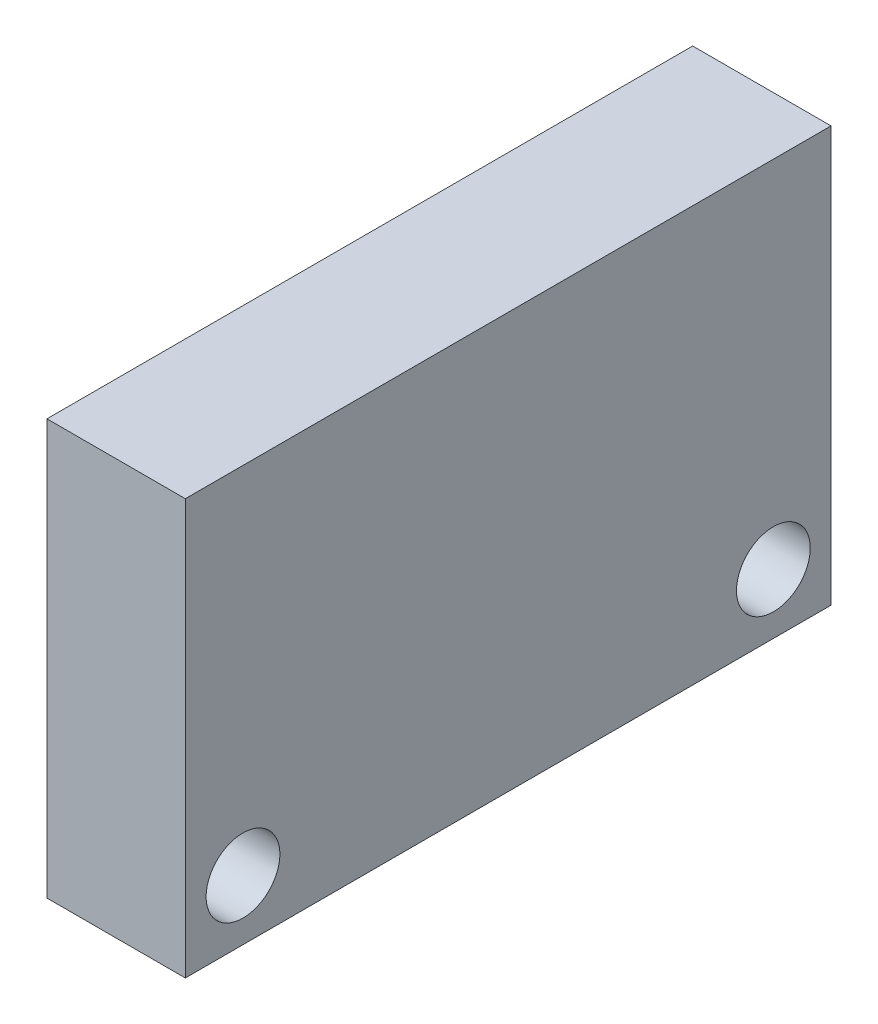
ISO-10303-21;
HEADER;
FILE_DESCRIPTION(('STEP AP214'),'2;1');
FILE_NAME('part.step','',(''),(''),'','','');
FILE_SCHEMA(('AUTOMOTIVE_DESIGN { 1 0 10303 214 1 1 1 1 }'));
ENDSEC;
DATA;
#1=APPLICATION_CONTEXT('core data for automotive mechanical design processes');
#2=APPLICATION_PROTOCOL_DEFINITION('international standard','automotive_design',2000,#1);
#3=PRODUCT_CONTEXT('',#1,'mechanical');
#4=PRODUCT('Part','Part','',(#3));
#5=PRODUCT_RELATED_PRODUCT_CATEGORY('part','',(#4));
#6=PRODUCT_DEFINITION_FORMATION('','',#4);
#7=PRODUCT_DEFINITION_CONTEXT('part definition',#1,'design');
#8=PRODUCT_DEFINITION('design','',#6,#7);
#9=PRODUCT_DEFINITION_SHAPE('','',#8);
#10=(LENGTH_UNIT() NAMED_UNIT(*) SI_UNIT(.MILLI.,.METRE.));
#11=(NAMED_UNIT(*) PLANE_ANGLE_UNIT() SI_UNIT($,.RADIAN.));
#12=(NAMED_UNIT(*) SI_UNIT($,.STERADIAN.) SOLID_ANGLE_UNIT());
#13=UNCERTAINTY_MEASURE_WITH_UNIT(LENGTH_MEASURE(1.E-05),#10,'distance_accuracy_value','');
#14=(GEOMETRIC_REPRESENTATION_CONTEXT(3) GLOBAL_UNCERTAINTY_ASSIGNED_CONTEXT((#13)) GLOBAL_UNIT_ASSIGNED_CONTEXT((#10,
#11,#12)) REPRESENTATION_CONTEXT('',''));
#15=CARTESIAN_POINT('',(0.,0.,0.));
#16=DIRECTION('',(0.,0.,1.));
#17=DIRECTION('',(1.,0.,0.));
#18=AXIS2_PLACEMENT_3D('',#15,#16,#17);
#19=CARTESIAN_POINT('',(-3.,-9.,28.));
#20=DIRECTION('',(1.,0.,0.));
#21=DIRECTION('',(0.,0.,-1.));
#22=AXIS2_PLACEMENT_3D('',#19,#20,#21);
#23=PLANE('',#22);
#24=CARTESIAN_POINT('',(-3.,-6.39999999999999,25.5));
#25=DIRECTION('',(-1.,0.,0.));
#26=DIRECTION('',(0.,0.,1.));
#27=AXIS2_PLACEMENT_3D('',#24,#25,#26);
#28=CIRCLE('',#27,1.6);
#29=CARTESIAN_POINT('',(-3.,-6.39999999999999,27.1));
#30=VERTEX_POINT('',#29);
#31=EDGE_CURVE('E116',#30,#30,#28,.T.);
#32=ORIENTED_EDGE('',*,*,#31,.F.);
#33=EDGE_LOOP('',(#32));
#34=FACE_BOUND('',#33,.T.);
#35=CARTESIAN_POINT('',(-3.,-6.39999999999999,2.5));
#36=DIRECTION('',(-1.,0.,0.));
#37=DIRECTION('',(0.,0.,1.));
#38=AXIS2_PLACEMENT_3D('',#35,#36,#37);
#39=CIRCLE('',#38,1.6);
#40=CARTESIAN_POINT('',(-3.,-6.39999999999999,4.1));
#41=VERTEX_POINT('',#40);
#42=EDGE_CURVE('E108',#41,#41,#39,.T.);
#43=ORIENTED_EDGE('',*,*,#42,.F.);
#44=EDGE_LOOP('',(#43));
#45=FACE_BOUND('',#44,.T.);
#46=DIRECTION('',(0.,-1.,0.));
#47=VECTOR('',#46,1.);
#48=CARTESIAN_POINT('',(-3.,-9.,0.));
#49=LINE('',#48,#47);
#50=CARTESIAN_POINT('',(-3.,9.,0.));
#51=VERTEX_POINT('',#50);
#52=CARTESIAN_POINT('',(-3.,-9.,0.));
#53=VERTEX_POINT('',#52);
#54=EDGE_CURVE('E99',#51,#53,#49,.T.);
#55=ORIENTED_EDGE('',*,*,#54,.T.);
#56=DIRECTION('',(0.,0.,-1.));
#57=VECTOR('',#56,1.);
#58=CARTESIAN_POINT('',(-3.,-9.,28.));
#59=LINE('',#58,#57);
#60=CARTESIAN_POINT('',(-3.,-9.,28.));
#61=VERTEX_POINT('',#60);
#62=EDGE_CURVE('E11',#61,#53,#59,.T.);
#63=ORIENTED_EDGE('',*,*,#62,.F.);
#64=DIRECTION('',(0.,-1.,0.));
#65=VECTOR('',#64,1.);
#66=CARTESIAN_POINT('',(-3.,-9.,28.));
#67=LINE('',#66,#65);
#68=CARTESIAN_POINT('',(-3.,9.,28.));
#69=VERTEX_POINT('',#68);
#70=EDGE_CURVE('E86',#69,#61,#67,.T.);
#71=ORIENTED_EDGE('',*,*,#70,.F.);
#72=DIRECTION('',(0.,0.,-1.));
#73=VECTOR('',#72,1.);
#74=CARTESIAN_POINT('',(-3.,9.,28.));
#75=LINE('',#74,#73);
#76=EDGE_CURVE('E95',#69,#51,#75,.T.);
#77=ORIENTED_EDGE('',*,*,#76,.T.);
#78=EDGE_LOOP('',(#55,#63,#71,#77));
#79=FACE_BOUND('',#78,.T.);
#80=ADVANCED_FACE('F33',(#34,#45,#79),#23,.F.);
#81=CARTESIAN_POINT('',(3.,-9.,28.));
#82=DIRECTION('',(0.,1.,0.));
#83=DIRECTION('',(0.,0.,1.));
#84=AXIS2_PLACEMENT_3D('',#81,#82,#83);
#85=PLANE('',#84);
#86=DIRECTION('',(1.,0.,0.));
#87=VECTOR('',#86,1.);
#88=CARTESIAN_POINT('',(3.,-9.,0.));
#89=LINE('',#88,#87);
#90=CARTESIAN_POINT('',(3.,-9.,0.));
#91=VERTEX_POINT('',#90);
#92=EDGE_CURVE('E90',#53,#91,#89,.T.);
#93=ORIENTED_EDGE('',*,*,#92,.T.);
#94=DIRECTION('',(0.,0.,-1.));
#95=VECTOR('',#94,1.);
#96=CARTESIAN_POINT('',(3.,-9.,28.));
#97=LINE('',#96,#95);
#98=CARTESIAN_POINT('',(3.,-9.,28.));
#99=VERTEX_POINT('',#98);
#100=EDGE_CURVE('E42',#99,#91,#97,.T.);
#101=ORIENTED_EDGE('',*,*,#100,.F.);
#102=DIRECTION('',(1.,0.,0.));
#103=VECTOR('',#102,1.);
#104=CARTESIAN_POINT('',(3.,-9.,28.));
#105=LINE('',#104,#103);
#106=EDGE_CURVE('E81',#61,#99,#105,.T.);
#107=ORIENTED_EDGE('',*,*,#106,.F.);
#108=ORIENTED_EDGE('',*,*,#62,.T.);
#109=EDGE_LOOP('',(#93,#101,#107,#108));
#110=FACE_BOUND('',#109,.T.);
#111=ADVANCED_FACE('F89',(#110),#85,.F.);
#112=CARTESIAN_POINT('',(3.,-9.,28.));
#113=DIRECTION('',(-1.,0.,0.));
#114=DIRECTION('',(0.,0.,1.));
#115=AXIS2_PLACEMENT_3D('',#112,#113,#114);
#116=PLANE('',#115);
#117=CARTESIAN_POINT('',(3.,-6.39999999999999,25.5));
#118=DIRECTION('',(-1.,0.,0.));
#119=DIRECTION('',(0.,0.,1.));
#120=AXIS2_PLACEMENT_3D('',#117,#118,#119);
#121=CIRCLE('',#120,1.6);
#122=CARTESIAN_POINT('',(3.,-6.39999999999999,27.1));
#123=VERTEX_POINT('',#122);
#124=EDGE_CURVE('E36',#123,#123,#121,.T.);
#125=ORIENTED_EDGE('',*,*,#124,.T.);
#126=EDGE_LOOP('',(#125));
#127=FACE_BOUND('',#126,.T.);
#128=CARTESIAN_POINT('',(3.,-6.39999999999999,2.5));
#129=DIRECTION('',(-1.,0.,0.));
#130=DIRECTION('',(0.,0.,1.));
#131=AXIS2_PLACEMENT_3D('',#128,#129,#130);
#132=CIRCLE('',#131,1.6);
#133=CARTESIAN_POINT('',(3.,-6.39999999999999,4.1));
#134=VERTEX_POINT('',#133);
#135=EDGE_CURVE('E102',#134,#134,#132,.T.);
#136=ORIENTED_EDGE('',*,*,#135,.T.);
#137=EDGE_LOOP('',(#136));
#138=FACE_BOUND('',#137,.T.);
#139=DIRECTION('',(0.,1.,0.));
#140=VECTOR('',#139,1.);
#141=CARTESIAN_POINT('',(3.,-9.,0.));
#142=LINE('',#141,#140);
#143=CARTESIAN_POINT('',(3.,9.,0.));
#144=VERTEX_POINT('',#143);
#145=EDGE_CURVE('E68',#91,#144,#142,.T.);
#146=ORIENTED_EDGE('',*,*,#145,.T.);
#147=DIRECTION('',(0.,0.,-1.));
#148=VECTOR('',#147,1.);
#149=CARTESIAN_POINT('',(3.,9.,28.));
#150=LINE('',#149,#148);
#151=CARTESIAN_POINT('',(3.,9.,28.));
#152=VERTEX_POINT('',#151);
#153=EDGE_CURVE('E91',#152,#144,#150,.T.);
#154=ORIENTED_EDGE('',*,*,#153,.F.);
#155=DIRECTION('',(0.,1.,0.));
#156=VECTOR('',#155,1.);
#157=CARTESIAN_POINT('',(3.,-9.,28.));
#158=LINE('',#157,#156);
#159=EDGE_CURVE('E84',#99,#152,#158,.T.);
#160=ORIENTED_EDGE('',*,*,#159,.F.);
#161=ORIENTED_EDGE('',*,*,#100,.T.);
#162=EDGE_LOOP('',(#146,#154,#160,#161));
#163=FACE_BOUND('',#162,.T.);
#164=ADVANCED_FACE('F93',(#127,#138,#163),#116,.F.);
#165=CARTESIAN_POINT('',(3.,9.,28.));
#166=DIRECTION('',(0.,-1.,0.));
#167=DIRECTION('',(0.,0.,-1.));
#168=AXIS2_PLACEMENT_3D('',#165,#166,#167);
#169=PLANE('',#168);
#170=DIRECTION('',(-1.,0.,0.));
#171=VECTOR('',#170,1.);
#172=CARTESIAN_POINT('',(3.,9.,0.));
#173=LINE('',#172,#171);
#174=EDGE_CURVE('E74',#144,#51,#173,.T.);
#175=ORIENTED_EDGE('',*,*,#174,.T.);
#176=ORIENTED_EDGE('',*,*,#76,.F.);
#177=DIRECTION('',(-1.,0.,0.));
#178=VECTOR('',#177,1.);
#179=CARTESIAN_POINT('',(3.,9.,28.));
#180=LINE('',#179,#178);
#181=EDGE_CURVE('E51',#152,#69,#180,.T.);
#182=ORIENTED_EDGE('',*,*,#181,.F.);
#183=ORIENTED_EDGE('',*,*,#153,.T.);
#184=EDGE_LOOP('',(#175,#176,#182,#183));
#185=FACE_BOUND('',#184,.T.);
#186=ADVANCED_FACE('F138',(#185),#169,.F.);
#187=CARTESIAN_POINT('',(0.,0.,28.));
#188=DIRECTION('',(0.,0.,1.));
#189=DIRECTION('',(1.,0.,0.));
#190=AXIS2_PLACEMENT_3D('',#187,#188,#189);
#191=PLANE('',#190);
#192=ORIENTED_EDGE('',*,*,#70,.T.);
#193=ORIENTED_EDGE('',*,*,#106,.T.);
#194=ORIENTED_EDGE('',*,*,#159,.T.);
#195=ORIENTED_EDGE('',*,*,#181,.T.);
#196=EDGE_LOOP('',(#192,#193,#194,#195));
#197=FACE_BOUND('',#196,.T.);
#198=ADVANCED_FACE('F82',(#197),#191,.T.);
#199=CARTESIAN_POINT('',(0.,0.,0.));
#200=DIRECTION('',(0.,0.,1.));
#201=DIRECTION('',(1.,0.,0.));
#202=AXIS2_PLACEMENT_3D('',#199,#200,#201);
#203=PLANE('',#202);
#204=ORIENTED_EDGE('',*,*,#54,.F.);
#205=ORIENTED_EDGE('',*,*,#174,.F.);
#206=ORIENTED_EDGE('',*,*,#145,.F.);
#207=ORIENTED_EDGE('',*,*,#92,.F.);
#208=EDGE_LOOP('',(#204,#205,#206,#207));
#209=FACE_BOUND('',#208,.T.);
#210=ADVANCED_FACE('F129',(#209),#203,.F.);
#211=CARTESIAN_POINT('',(25.,-6.39999999999999,2.5));
#212=DIRECTION('',(-1.,0.,0.));
#213=DIRECTION('',(0.,0.,1.));
#214=AXIS2_PLACEMENT_3D('',#211,#212,#213);
#215=CYLINDRICAL_SURFACE('',#214,1.6);
#216=ORIENTED_EDGE('',*,*,#42,.T.);
#217=EDGE_LOOP('',(#216));
#218=FACE_BOUND('',#217,.T.);
#219=ORIENTED_EDGE('',*,*,#135,.F.);
#220=EDGE_LOOP('',(#219));
#221=FACE_BOUND('',#220,.T.);
#222=ADVANCED_FACE('F131',(#218,#221),#215,.F.);
#223=CARTESIAN_POINT('',(25.,-6.39999999999999,25.5));
#224=DIRECTION('',(-1.,0.,0.));
#225=DIRECTION('',(0.,0.,1.));
#226=AXIS2_PLACEMENT_3D('',#223,#224,#225);
#227=CYLINDRICAL_SURFACE('',#226,1.6);
#228=ORIENTED_EDGE('',*,*,#31,.T.);
#229=EDGE_LOOP('',(#228));
#230=FACE_BOUND('',#229,.T.);
#231=ORIENTED_EDGE('',*,*,#124,.F.);
#232=EDGE_LOOP('',(#231));
#233=FACE_BOUND('',#232,.T.);
#234=ADVANCED_FACE('F121',(#230,#233),#227,.F.);
#235=CLOSED_SHELL('',(#80,#111,#164,#186,#198,#210,#222,#234));
#236=MANIFOLD_SOLID_BREP('B2',#235);
#237=ADVANCED_BREP_SHAPE_REPRESENTATION('',(#18,#236),#14);
#238=SHAPE_DEFINITION_REPRESENTATION(#9,#237);
ENDSEC;
END-ISO-10303-21;
